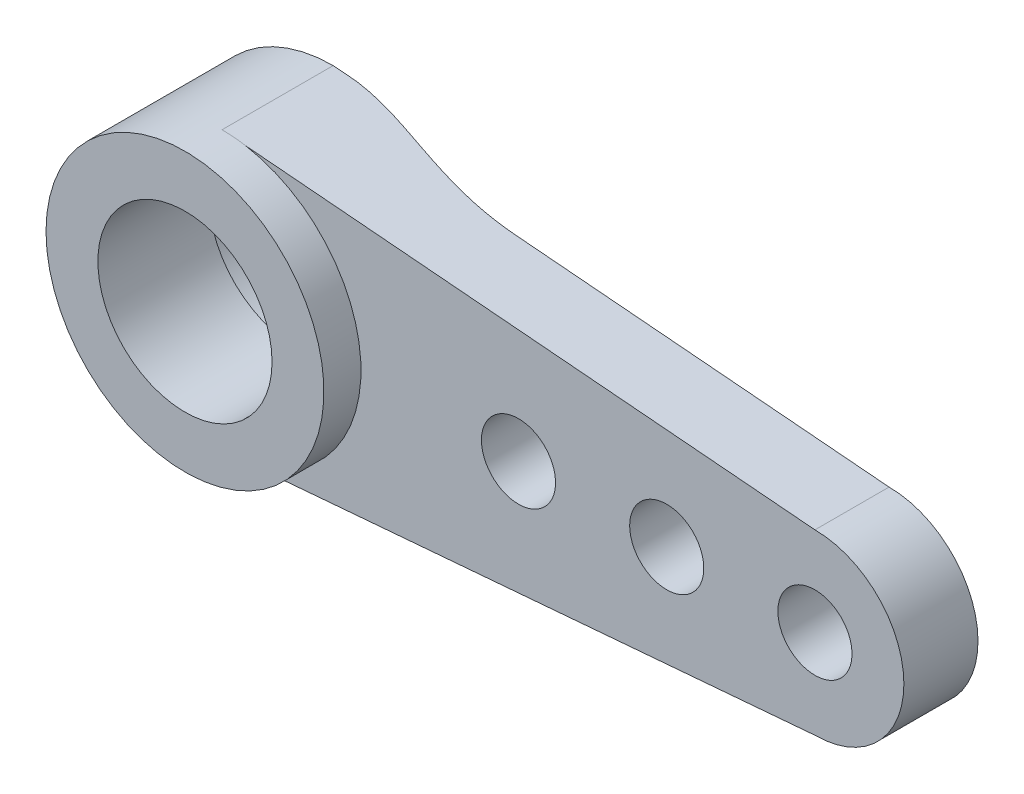
ISO-10303-21;
HEADER;
FILE_DESCRIPTION(('STEP AP214'),'2;1');
FILE_NAME('part.step','',(''),(''),'','','');
FILE_SCHEMA(('AUTOMOTIVE_DESIGN { 1 0 10303 214 1 1 1 1 }'));
ENDSEC;
DATA;
#1=APPLICATION_CONTEXT('core data for automotive mechanical design processes');
#2=APPLICATION_PROTOCOL_DEFINITION('international standard','automotive_design',2000,#1);
#3=PRODUCT_CONTEXT('',#1,'mechanical');
#4=PRODUCT('Part','Part','',(#3));
#5=PRODUCT_RELATED_PRODUCT_CATEGORY('part','',(#4));
#6=PRODUCT_DEFINITION_FORMATION('','',#4);
#7=PRODUCT_DEFINITION_CONTEXT('part definition',#1,'design');
#8=PRODUCT_DEFINITION('design','',#6,#7);
#9=PRODUCT_DEFINITION_SHAPE('','',#8);
#10=(LENGTH_UNIT() NAMED_UNIT(*) SI_UNIT(.MILLI.,.METRE.));
#11=(NAMED_UNIT(*) PLANE_ANGLE_UNIT() SI_UNIT($,.RADIAN.));
#12=(NAMED_UNIT(*) SI_UNIT($,.STERADIAN.) SOLID_ANGLE_UNIT());
#13=UNCERTAINTY_MEASURE_WITH_UNIT(LENGTH_MEASURE(1.E-05),#10,'distance_accuracy_value','');
#14=(GEOMETRIC_REPRESENTATION_CONTEXT(3) GLOBAL_UNCERTAINTY_ASSIGNED_CONTEXT((#13)) GLOBAL_UNIT_ASSIGNED_CONTEXT((#10,
#11,#12)) REPRESENTATION_CONTEXT('',''));
#15=CARTESIAN_POINT('',(0.,0.,0.));
#16=DIRECTION('',(0.,0.,1.));
#17=DIRECTION('',(1.,0.,0.));
#18=AXIS2_PLACEMENT_3D('',#15,#16,#17);
#19=CARTESIAN_POINT('',(0.,0.,0.));
#20=DIRECTION('',(0.,0.,1.));
#21=DIRECTION('',(1.,0.,0.));
#22=AXIS2_PLACEMENT_3D('',#19,#20,#21);
#23=PLANE('',#22);
#24=CARTESIAN_POINT('',(0.,0.,0.));
#25=DIRECTION('',(0.,0.,1.));
#26=DIRECTION('',(1.,0.,0.));
#27=AXIS2_PLACEMENT_3D('',#24,#25,#26);
#28=CIRCLE('',#27,2.35);
#29=CARTESIAN_POINT('',(2.35,0.,0.));
#30=VERTEX_POINT('',#29);
#31=EDGE_CURVE('E140',#30,#30,#28,.T.);
#32=ORIENTED_EDGE('',*,*,#31,.T.);
#33=EDGE_LOOP('',(#32));
#34=FACE_BOUND('',#33,.T.);
#35=CARTESIAN_POINT('',(0.,0.,0.));
#36=DIRECTION('',(0.,0.,-1.));
#37=DIRECTION('',(-1.,0.,0.));
#38=AXIS2_PLACEMENT_3D('',#35,#36,#37);
#39=CIRCLE('',#38,2.75);
#40=CARTESIAN_POINT('',(-2.75,0.,0.));
#41=VERTEX_POINT('',#40);
#42=EDGE_CURVE('E130',#41,#41,#39,.T.);
#43=ORIENTED_EDGE('',*,*,#42,.T.);
#44=EDGE_LOOP('',(#43));
#45=FACE_BOUND('',#44,.T.);
#46=ADVANCED_FACE('F43',(#34,#45),#23,.F.);
#47=CARTESIAN_POINT('',(0.314169632208205,-3.72349193728243,2.));
#48=DIRECTION('',(-0.0840762554154538,0.996459323442415,0.));
#49=DIRECTION('',(-0.996459323442415,-0.0840762554154538,0.));
#50=AXIS2_PLACEMENT_3D('',#47,#48,#49);
#51=PLANE('',#50);
#52=DIRECTION('',(0.,0.,-1.));
#53=VECTOR('',#52,1.);
#54=CARTESIAN_POINT('',(0.,-3.75,2.));
#55=LINE('',#54,#53);
#56=CARTESIAN_POINT('',(0.,-3.75,2.));
#57=VERTEX_POINT('',#56);
#58=CARTESIAN_POINT('',(0.,-3.75,-1.));
#59=VERTEX_POINT('',#58);
#60=EDGE_CURVE('E155',#57,#59,#55,.T.);
#61=ORIENTED_EDGE('',*,*,#60,.T.);
#62=DIRECTION('',(-0.996459323442415,-0.0840762554154538,0.));
#63=VECTOR('',#62,1.);
#64=CARTESIAN_POINT('',(0.314169632208205,-3.72349193728243,-1.));
#65=LINE('',#64,#63);
#66=CARTESIAN_POINT('',(0.628339264416419,-3.69698387456486,-1.));
#67=VERTEX_POINT('',#66);
#68=EDGE_CURVE('E123',#67,#59,#65,.T.);
#69=ORIENTED_EDGE('',*,*,#68,.F.);
#70=CARTESIAN_POINT('',(0.628339264416419,-3.69698387456486,-1.));
#71=CARTESIAN_POINT('',(0.697307809076873,-3.69116465360914,-0.995646343519187));
#72=CARTESIAN_POINT('',(0.766175130025618,-3.68535397340409,-0.989869657206065));
#73=CARTESIAN_POINT('',(0.903617625135459,-3.6737572628792,-0.975707941496995));
#74=CARTESIAN_POINT('',(0.97219290150449,-3.66797122393556,-0.967323916505959));
#75=CARTESIAN_POINT('',(1.17697233613225,-3.65069295913884,-0.938673764554081));
#76=CARTESIAN_POINT('',(1.31268782647033,-3.63924196464157,-0.914877548381426));
#77=CARTESIAN_POINT('',(1.58261540354773,-3.61646682532566,-0.860330672785768));
#78=CARTESIAN_POINT('',(1.71682799145541,-3.60514263822095,-0.829582408791605));
#79=CARTESIAN_POINT('',(1.98432680167271,-3.58257242610886,-0.76362642174831));
#80=CARTESIAN_POINT('',(2.11761154710652,-3.57132652571289,-0.728412796780356));
#81=CARTESIAN_POINT('',(2.40078592510154,-3.54743368756956,-0.651161822433077));
#82=CARTESIAN_POINT('',(2.55059419929654,-3.53479361443435,-0.608830890588668));
#83=CARTESIAN_POINT('',(2.85023264998082,-3.50951162015787,-0.524225869547491));
#84=CARTESIAN_POINT('',(3.00006282707764,-3.49686969896532,-0.481951782524331));
#85=CARTESIAN_POINT('',(3.30007241737523,-3.47155638978396,-0.399810269796279));
#86=CARTESIAN_POINT('',(3.45025056769592,-3.45888510835066,-0.359938282763937));
#87=CARTESIAN_POINT('',(3.75164512261767,-3.43345494277913,-0.284382062671771));
#88=CARTESIAN_POINT('',(3.90286139237834,-3.42069607001808,-0.248697296237507));
#89=CARTESIAN_POINT('',(4.20690839440776,-3.39504210422184,-0.183002412446932));
#90=CARTESIAN_POINT('',(4.35974211135114,-3.38214675935475,-0.153005995072535));
#91=CARTESIAN_POINT('',(4.66660902112056,-3.35625486384295,-0.100149696307815));
#92=CARTESIAN_POINT('',(4.82064191609038,-3.34325833832987,-0.0772880972815289));
#93=CARTESIAN_POINT('',(5.13110304168887,-3.3170631808575,-0.0396998057614398));
#94=CARTESIAN_POINT('',(5.2875403993614,-3.30386377880388,-0.0250470876141203));
#95=CARTESIAN_POINT('',(5.60116404300296,-3.27740178387162,-0.00517827823070864));
#96=CARTESIAN_POINT('',(5.75835094220332,-3.26413913925159,2.79034982661632E-05));
#97=CARTESIAN_POINT('',(5.91560113058202,-3.25087115460714,0.));
#98=B_SPLINE_CURVE_WITH_KNOTS('',3,(#70,#71,#72,#73,#74,#75,#76,#77,#78,#79,#80,#81,#82,#83,#84,
#85,#86,#87,#88,#89,#90,#91,#92,#93,#94,#95,#96,#97),.UNSPECIFIED.,.F.,.F.,(4,2,2,2,2,2,2,2,2,2,
2,2,2,4),(0.,0.208017689106241,0.41595534422088,0.830452596831007,1.24480724547458,
1.65971537385917,2.12827229827095,2.59684665676368,3.06450121446885,3.53209613681727,
4.00080330977544,4.46939755898619,4.94214928417651,5.41539664437466),.UNSPECIFIED.);
#99=CARTESIAN_POINT('',(5.91560113058202,-3.25087115460714,0.));
#100=VERTEX_POINT('',#99);
#101=EDGE_CURVE('E57',#67,#100,#98,.T.);
#102=ORIENTED_EDGE('',*,*,#101,.T.);
#103=DIRECTION('',(0.996459323442415,0.0840762554154538,0.));
#104=VECTOR('',#103,1.);
#105=CARTESIAN_POINT('',(0.314169632208205,-3.72349193728243,0.));
#106=LINE('',#105,#104);
#107=CARTESIAN_POINT('',(16.,-2.4,0.));
#108=VERTEX_POINT('',#107);
#109=EDGE_CURVE('E158',#100,#108,#106,.T.);
#110=ORIENTED_EDGE('',*,*,#109,.T.);
#111=DIRECTION('',(0.,0.,-1.));
#112=VECTOR('',#111,1.);
#113=CARTESIAN_POINT('',(16.,-2.4,2.));
#114=LINE('',#113,#112);
#115=CARTESIAN_POINT('',(16.,-2.4,2.));
#116=VERTEX_POINT('',#115);
#117=EDGE_CURVE('E169',#116,#108,#114,.T.);
#118=ORIENTED_EDGE('',*,*,#117,.F.);
#119=DIRECTION('',(0.996459323442415,0.0840762554154538,0.));
#120=VECTOR('',#119,1.);
#121=CARTESIAN_POINT('',(0.314169632208205,-3.72349193728243,2.));
#122=LINE('',#121,#120);
#123=CARTESIAN_POINT('',(0.628339264416414,-3.69698387456486,2.));
#124=VERTEX_POINT('',#123);
#125=EDGE_CURVE('E149',#124,#116,#122,.T.);
#126=ORIENTED_EDGE('',*,*,#125,.F.);
#127=EDGE_CURVE('E145',#57,#124,#122,.T.);
#128=ORIENTED_EDGE('',*,*,#127,.F.);
#129=EDGE_LOOP('',(#61,#69,#102,#110,#118,#126,#128));
#130=FACE_BOUND('',#129,.T.);
#131=ADVANCED_FACE('F177',(#130),#51,.F.);
#132=CARTESIAN_POINT('',(16.,0.,2.));
#133=DIRECTION('',(0.,0.,-1.));
#134=DIRECTION('',(-1.,0.,0.));
#135=AXIS2_PLACEMENT_3D('',#132,#133,#134);
#136=CYLINDRICAL_SURFACE('',#135,2.4);
#137=CARTESIAN_POINT('',(16.,0.,0.));
#138=DIRECTION('',(0.,0.,1.));
#139=DIRECTION('',(1.,0.,0.));
#140=AXIS2_PLACEMENT_3D('',#137,#138,#139);
#141=CIRCLE('',#140,2.4);
#142=CARTESIAN_POINT('',(16.,2.4,0.));
#143=VERTEX_POINT('',#142);
#144=EDGE_CURVE('E160',#108,#143,#141,.T.);
#145=ORIENTED_EDGE('',*,*,#144,.T.);
#146=DIRECTION('',(0.,0.,-1.));
#147=VECTOR('',#146,1.);
#148=CARTESIAN_POINT('',(16.,2.4,2.));
#149=LINE('',#148,#147);
#150=CARTESIAN_POINT('',(16.,2.4,2.));
#151=VERTEX_POINT('',#150);
#152=EDGE_CURVE('E167',#151,#143,#149,.T.);
#153=ORIENTED_EDGE('',*,*,#152,.F.);
#154=CARTESIAN_POINT('',(16.,0.,2.));
#155=DIRECTION('',(0.,0.,1.));
#156=DIRECTION('',(1.,0.,0.));
#157=AXIS2_PLACEMENT_3D('',#154,#155,#156);
#158=CIRCLE('',#157,2.4);
#159=EDGE_CURVE('E148',#116,#151,#158,.T.);
#160=ORIENTED_EDGE('',*,*,#159,.F.);
#161=ORIENTED_EDGE('',*,*,#117,.T.);
#162=EDGE_LOOP('',(#145,#153,#160,#161));
#163=FACE_BOUND('',#162,.T.);
#164=ADVANCED_FACE('F181',(#163),#136,.T.);
#165=CARTESIAN_POINT('',(0.314169632208205,3.72349193728243,2.));
#166=DIRECTION('',(0.0840762554154538,0.996459323442415,0.));
#167=DIRECTION('',(-0.996459323442415,0.0840762554154538,0.));
#168=AXIS2_PLACEMENT_3D('',#165,#166,#167);
#169=PLANE('',#168);
#170=DIRECTION('',(0.996459323442415,-0.0840762554154538,0.));
#171=VECTOR('',#170,1.);
#172=CARTESIAN_POINT('',(0.314169632208205,3.72349193728243,0.));
#173=LINE('',#172,#171);
#174=CARTESIAN_POINT('',(5.91560113058202,3.25087115460714,0.));
#175=VERTEX_POINT('',#174);
#176=EDGE_CURVE('E110',#175,#143,#173,.T.);
#177=ORIENTED_EDGE('',*,*,#176,.F.);
#178=CARTESIAN_POINT('',(5.91560113058202,3.25087115460714,0.));
#179=CARTESIAN_POINT('',(5.8223810347142,3.25873660019599,1.85233074722115E-06));
#180=CARTESIAN_POINT('',(5.72917408115278,3.26660093690273,-0.00182128048230477));
#181=CARTESIAN_POINT('',(5.54290973526612,3.28231699108692,-0.00892990292535579));
#182=CARTESIAN_POINT('',(5.44985231576945,3.29016871085695,-0.0142146693285458));
#183=CARTESIAN_POINT('',(5.17135717383487,3.31366673845768,-0.0349570064980779));
#184=CARTESIAN_POINT('',(4.98626852749528,3.32928359299259,-0.0553039433228232));
#185=CARTESIAN_POINT('',(4.61810269891063,3.36034758477942,-0.107209190519749));
#186=CARTESIAN_POINT('',(4.4350221748687,3.37579500399545,-0.138744466943538));
#187=CARTESIAN_POINT('',(4.07059315570442,3.40654370248744,-0.210936105991536));
#188=CARTESIAN_POINT('',(3.88924557068151,3.42184490497375,-0.251597013276189));
#189=CARTESIAN_POINT('',(3.58104291082371,3.44784950439925,-0.326603678525961));
#190=CARTESIAN_POINT('',(3.45378204869383,3.45858713964146,-0.359311780108495));
#191=CARTESIAN_POINT('',(3.19984629936514,3.48001296849107,-0.426930981262496));
#192=CARTESIAN_POINT('',(3.07317141442429,3.49070116190795,-0.461842089315281));
#193=CARTESIAN_POINT('',(2.82018869634357,3.51204657874601,-0.532595604277613));
#194=CARTESIAN_POINT('',(2.69388065728612,3.52270381954148,-0.568437282526414));
#195=CARTESIAN_POINT('',(2.44109547309834,3.54403256945733,-0.639615809919882));
#196=CARTESIAN_POINT('',(2.3146183012975,3.55470408082802,-0.674952565674266));
#197=CARTESIAN_POINT('',(2.06029112590282,3.57616293625195,-0.743583883172638));
#198=CARTESIAN_POINT('',(1.93243743923451,3.58695059106459,-0.776864907120628));
#199=CARTESIAN_POINT('',(1.67568028830843,3.60861447567398,-0.839090803045952));
#200=CARTESIAN_POINT('',(1.546777050505,3.61949068636364,-0.868036585568116));
#201=CARTESIAN_POINT('',(1.35217605089325,3.63591014570588,-0.906573550015068));
#202=CARTESIAN_POINT('',(1.28696339914608,3.64141246319705,-0.918625682489015));
#203=CARTESIAN_POINT('',(1.15621398974743,3.65244444461506,-0.940790837571174));
#204=CARTESIAN_POINT('',(1.09067725747785,3.65797410640031,-0.950904009646046));
#205=CARTESIAN_POINT('',(0.959155350104703,3.66907126733491,-0.968948471693051));
#206=CARTESIAN_POINT('',(0.893169504266445,3.67463882307752,-0.976874893619771));
#207=CARTESIAN_POINT('',(0.760932515856885,3.68579631897458,-0.990307351936384));
#208=CARTESIAN_POINT('',(0.694681291672577,3.69138626601513,-0.995812575028848));
#209=CARTESIAN_POINT('',(0.628339264416419,3.69698387456486,-0.999999999999999));
#210=B_SPLINE_CURVE_WITH_KNOTS('',3,(#178,#179,#180,#181,#182,#183,#184,#185,#186,#187,#188,
#189,#190,#191,#192,#193,#194,#195,#196,#197,#198,#199,#200,#201,#202,#203,#204,#205,#206,#207,
#208,#209),.UNSPECIFIED.,.F.,.F.,(4,2,2,2,2,2,2,2,2,2,2,2,2,2,2,4),(0.,0.280613830358858,
0.561169051758918,1.12129420707623,1.68027283535502,2.23953046104622,2.63501195788567,
3.03049497737555,3.4256771449433,3.8209314830202,4.21855935170722,4.61610358784941,
4.81571399344804,5.0153090056913,5.21534482639423,5.41544778928743),.UNSPECIFIED.);
#211=CARTESIAN_POINT('',(0.628339264416419,3.69698387456486,-1.));
#212=VERTEX_POINT('',#211);
#213=EDGE_CURVE('E11',#175,#212,#210,.T.);
#214=ORIENTED_EDGE('',*,*,#213,.T.);
#215=DIRECTION('',(0.996459323442415,-0.0840762554154538,0.));
#216=VECTOR('',#215,1.);
#217=CARTESIAN_POINT('',(0.314169632208205,3.72349193728243,-1.));
#218=LINE('',#217,#216);
#219=CARTESIAN_POINT('',(0.,3.75,-1.));
#220=VERTEX_POINT('',#219);
#221=EDGE_CURVE('E108',#220,#212,#218,.T.);
#222=ORIENTED_EDGE('',*,*,#221,.F.);
#223=DIRECTION('',(0.,0.,-1.));
#224=VECTOR('',#223,1.);
#225=CARTESIAN_POINT('',(0.,3.75,2.));
#226=LINE('',#225,#224);
#227=CARTESIAN_POINT('',(0.,3.75,2.));
#228=VERTEX_POINT('',#227);
#229=EDGE_CURVE('E165',#228,#220,#226,.T.);
#230=ORIENTED_EDGE('',*,*,#229,.F.);
#231=DIRECTION('',(0.996459323442415,-0.0840762554154538,0.));
#232=VECTOR('',#231,1.);
#233=CARTESIAN_POINT('',(0.314169632208205,3.72349193728243,2.));
#234=LINE('',#233,#232);
#235=CARTESIAN_POINT('',(0.628339264416414,3.69698387456486,2.));
#236=VERTEX_POINT('',#235);
#237=EDGE_CURVE('E153',#228,#236,#234,.T.);
#238=ORIENTED_EDGE('',*,*,#237,.T.);
#239=EDGE_CURVE('E152',#236,#151,#234,.T.);
#240=ORIENTED_EDGE('',*,*,#239,.T.);
#241=ORIENTED_EDGE('',*,*,#152,.T.);
#242=EDGE_LOOP('',(#177,#214,#222,#230,#238,#240,#241));
#243=FACE_BOUND('',#242,.T.);
#244=ADVANCED_FACE('F107',(#243),#169,.T.);
#245=CARTESIAN_POINT('',(0.,0.,2.));
#246=DIRECTION('',(0.,0.,-1.));
#247=DIRECTION('',(-1.,0.,0.));
#248=AXIS2_PLACEMENT_3D('',#245,#246,#247);
#249=CYLINDRICAL_SURFACE('',#248,2.35);
#250=ORIENTED_EDGE('',*,*,#31,.F.);
#251=EDGE_LOOP('',(#250));
#252=FACE_BOUND('',#251,.T.);
#253=CARTESIAN_POINT('',(0.,0.,3.));
#254=DIRECTION('',(0.,0.,1.));
#255=DIRECTION('',(1.,0.,0.));
#256=AXIS2_PLACEMENT_3D('',#253,#254,#255);
#257=CIRCLE('',#256,2.35);
#258=CARTESIAN_POINT('',(2.35,0.,3.));
#259=VERTEX_POINT('',#258);
#260=EDGE_CURVE('E129',#259,#259,#257,.T.);
#261=ORIENTED_EDGE('',*,*,#260,.T.);
#262=EDGE_LOOP('',(#261));
#263=FACE_BOUND('',#262,.T.);
#264=ADVANCED_FACE('F182',(#252,#263),#249,.F.);
#265=CARTESIAN_POINT('',(0.,0.,2.));
#266=DIRECTION('',(0.,0.,-1.));
#267=DIRECTION('',(-1.,0.,0.));
#268=AXIS2_PLACEMENT_3D('',#265,#266,#267);
#269=CYLINDRICAL_SURFACE('',#268,3.75);
#270=ORIENTED_EDGE('',*,*,#229,.T.);
#271=CARTESIAN_POINT('',(0.,0.,-1.));
#272=DIRECTION('',(0.,0.,-1.));
#273=DIRECTION('',(-1.,0.,0.));
#274=AXIS2_PLACEMENT_3D('',#271,#272,#273);
#275=CIRCLE('',#274,3.75);
#276=EDGE_CURVE('E120',#59,#220,#275,.T.);
#277=ORIENTED_EDGE('',*,*,#276,.F.);
#278=ORIENTED_EDGE('',*,*,#60,.F.);
#279=CARTESIAN_POINT('',(0.,0.,2.));
#280=DIRECTION('',(0.,0.,1.));
#281=DIRECTION('',(1.,0.,0.));
#282=AXIS2_PLACEMENT_3D('',#279,#280,#281);
#283=CIRCLE('',#282,3.75);
#284=EDGE_CURVE('E136',#57,#124,#283,.T.);
#285=ORIENTED_EDGE('',*,*,#284,.T.);
#286=EDGE_CURVE('E144',#124,#236,#283,.T.);
#287=ORIENTED_EDGE('',*,*,#286,.T.);
#288=EDGE_CURVE('E141',#236,#228,#283,.T.);
#289=ORIENTED_EDGE('',*,*,#288,.T.);
#290=EDGE_LOOP('',(#270,#277,#278,#285,#287,#289));
#291=FACE_BOUND('',#290,.T.);
#292=CARTESIAN_POINT('',(0.,0.,3.));
#293=DIRECTION('',(0.,0.,1.));
#294=DIRECTION('',(-1.,0.,0.));
#295=AXIS2_PLACEMENT_3D('',#292,#293,#294);
#296=CIRCLE('',#295,3.75);
#297=CARTESIAN_POINT('',(-3.75,0.,3.));
#298=VERTEX_POINT('',#297);
#299=EDGE_CURVE('E137',#298,#298,#296,.T.);
#300=ORIENTED_EDGE('',*,*,#299,.F.);
#301=EDGE_LOOP('',(#300));
#302=FACE_BOUND('',#301,.T.);
#303=ADVANCED_FACE('F184',(#291,#302),#269,.T.);
#304=CARTESIAN_POINT('',(0.,0.,2.));
#305=DIRECTION('',(0.,0.,1.));
#306=DIRECTION('',(1.,0.,0.));
#307=AXIS2_PLACEMENT_3D('',#304,#305,#306);
#308=PLANE('',#307);
#309=CARTESIAN_POINT('',(16.,0.,2.));
#310=DIRECTION('',(0.,0.,1.));
#311=DIRECTION('',(1.,0.,0.));
#312=AXIS2_PLACEMENT_3D('',#309,#310,#311);
#313=CIRCLE('',#312,1.);
#314=CARTESIAN_POINT('',(15.,0.,2.));
#315=VERTEX_POINT('',#314);
#316=EDGE_CURVE('E271',#315,#315,#313,.F.);
#317=ORIENTED_EDGE('',*,*,#316,.T.);
#318=EDGE_LOOP('',(#317));
#319=FACE_BOUND('',#318,.T.);
#320=CARTESIAN_POINT('',(12.,0.,2.));
#321=DIRECTION('',(0.,0.,1.));
#322=DIRECTION('',(1.,0.,0.));
#323=AXIS2_PLACEMENT_3D('',#320,#321,#322);
#324=CIRCLE('',#323,1.);
#325=CARTESIAN_POINT('',(11.,0.,2.));
#326=VERTEX_POINT('',#325);
#327=EDGE_CURVE('E276',#326,#326,#324,.F.);
#328=ORIENTED_EDGE('',*,*,#327,.T.);
#329=EDGE_LOOP('',(#328));
#330=FACE_BOUND('',#329,.T.);
#331=CARTESIAN_POINT('',(8.,0.,2.));
#332=DIRECTION('',(0.,0.,1.));
#333=DIRECTION('',(1.,0.,0.));
#334=AXIS2_PLACEMENT_3D('',#331,#332,#333);
#335=CIRCLE('',#334,1.);
#336=CARTESIAN_POINT('',(7.,0.,2.));
#337=VERTEX_POINT('',#336);
#338=EDGE_CURVE('E280',#337,#337,#335,.F.);
#339=ORIENTED_EDGE('',*,*,#338,.T.);
#340=EDGE_LOOP('',(#339));
#341=FACE_BOUND('',#340,.T.);
#342=ORIENTED_EDGE('',*,*,#286,.F.);
#343=ORIENTED_EDGE('',*,*,#125,.T.);
#344=ORIENTED_EDGE('',*,*,#159,.T.);
#345=ORIENTED_EDGE('',*,*,#239,.F.);
#346=EDGE_LOOP('',(#342,#343,#344,#345));
#347=FACE_BOUND('',#346,.T.);
#348=ADVANCED_FACE('F190',(#319,#330,#341,#347),#308,.T.);
#349=CARTESIAN_POINT('',(16.,0.,0.));
#350=DIRECTION('',(0.,0.,-1.));
#351=DIRECTION('',(-1.,0.,0.));
#352=AXIS2_PLACEMENT_3D('',#349,#350,#351);
#353=CIRCLE('',#352,1.);
#354=CARTESIAN_POINT('',(15.,0.,0.));
#355=VERTEX_POINT('',#354);
#356=EDGE_CURVE('E133',#355,#355,#353,.T.);
#357=ORIENTED_EDGE('',*,*,#356,.F.);
#358=EDGE_LOOP('',(#357));
#359=FACE_BOUND('',#358,.T.);
#360=CARTESIAN_POINT('',(12.,0.,0.));
#361=DIRECTION('',(0.,0.,-1.));
#362=DIRECTION('',(-1.,0.,0.));
#363=AXIS2_PLACEMENT_3D('',#360,#361,#362);
#364=CIRCLE('',#363,1.);
#365=CARTESIAN_POINT('',(11.,0.,0.));
#366=VERTEX_POINT('',#365);
#367=EDGE_CURVE('E221',#366,#366,#364,.T.);
#368=ORIENTED_EDGE('',*,*,#367,.F.);
#369=EDGE_LOOP('',(#368));
#370=FACE_BOUND('',#369,.T.);
#371=CARTESIAN_POINT('',(8.,0.,0.));
#372=DIRECTION('',(0.,0.,-1.));
#373=DIRECTION('',(-1.,0.,0.));
#374=AXIS2_PLACEMENT_3D('',#371,#372,#373);
#375=CIRCLE('',#374,1.);
#376=CARTESIAN_POINT('',(7.,0.,0.));
#377=VERTEX_POINT('',#376);
#378=EDGE_CURVE('E224',#377,#377,#375,.T.);
#379=ORIENTED_EDGE('',*,*,#378,.F.);
#380=EDGE_LOOP('',(#379));
#381=FACE_BOUND('',#380,.T.);
#382=ORIENTED_EDGE('',*,*,#109,.F.);
#383=CARTESIAN_POINT('',(0.,0.,0.));
#384=DIRECTION('',(0.,0.,1.));
#385=DIRECTION('',(1.,0.,0.));
#386=AXIS2_PLACEMENT_3D('',#383,#384,#385);
#387=CIRCLE('',#386,6.75);
#388=EDGE_CURVE('E70',#100,#175,#387,.T.);
#389=ORIENTED_EDGE('',*,*,#388,.T.);
#390=ORIENTED_EDGE('',*,*,#176,.T.);
#391=ORIENTED_EDGE('',*,*,#144,.F.);
#392=EDGE_LOOP('',(#382,#389,#390,#391));
#393=FACE_BOUND('',#392,.T.);
#394=ADVANCED_FACE('F198',(#359,#370,#381,#393),#23,.F.);
#395=CARTESIAN_POINT('',(0.,0.,2.));
#396=DIRECTION('',(0.,0.,-1.));
#397=DIRECTION('',(-1.,0.,0.));
#398=AXIS2_PLACEMENT_3D('',#395,#396,#397);
#399=PLANE('',#398);
#400=ORIENTED_EDGE('',*,*,#237,.F.);
#401=ORIENTED_EDGE('',*,*,#288,.F.);
#402=EDGE_LOOP('',(#400,#401));
#403=FACE_BOUND('',#402,.T.);
#404=ADVANCED_FACE('F204',(#403),#399,.T.);
#405=CARTESIAN_POINT('',(0.,0.,3.));
#406=DIRECTION('',(0.,0.,-1.));
#407=DIRECTION('',(-1.,0.,0.));
#408=AXIS2_PLACEMENT_3D('',#405,#406,#407);
#409=PLANE('',#408);
#410=ORIENTED_EDGE('',*,*,#299,.T.);
#411=EDGE_LOOP('',(#410));
#412=FACE_BOUND('',#411,.T.);
#413=ORIENTED_EDGE('',*,*,#260,.F.);
#414=EDGE_LOOP('',(#413));
#415=FACE_BOUND('',#414,.T.);
#416=ADVANCED_FACE('F210',(#412,#415),#409,.F.);
#417=ORIENTED_EDGE('',*,*,#284,.F.);
#418=ORIENTED_EDGE('',*,*,#127,.T.);
#419=EDGE_LOOP('',(#417,#418));
#420=FACE_BOUND('',#419,.T.);
#421=ADVANCED_FACE('F213',(#420),#399,.T.);
#422=CARTESIAN_POINT('',(0.,0.,-1.));
#423=DIRECTION('',(0.,0.,1.));
#424=DIRECTION('',(1.,0.,0.));
#425=AXIS2_PLACEMENT_3D('',#422,#423,#424);
#426=CYLINDRICAL_SURFACE('',#425,2.75);
#427=CARTESIAN_POINT('',(0.,0.,-1.));
#428=DIRECTION('',(0.,0.,-1.));
#429=DIRECTION('',(-1.,0.,0.));
#430=AXIS2_PLACEMENT_3D('',#427,#428,#429);
#431=CIRCLE('',#430,2.75);
#432=CARTESIAN_POINT('',(-2.75,0.,-1.));
#433=VERTEX_POINT('',#432);
#434=EDGE_CURVE('E121',#433,#433,#431,.T.);
#435=ORIENTED_EDGE('',*,*,#434,.T.);
#436=EDGE_LOOP('',(#435));
#437=FACE_BOUND('',#436,.T.);
#438=ORIENTED_EDGE('',*,*,#42,.F.);
#439=EDGE_LOOP('',(#438));
#440=FACE_BOUND('',#439,.T.);
#441=ADVANCED_FACE('F242',(#437,#440),#426,.F.);
#442=CARTESIAN_POINT('',(0.,0.,-1.));
#443=DIRECTION('',(0.,0.,-1.));
#444=DIRECTION('',(-1.,0.,0.));
#445=AXIS2_PLACEMENT_3D('',#442,#443,#444);
#446=PLANE('',#445);
#447=ORIENTED_EDGE('',*,*,#434,.F.);
#448=EDGE_LOOP('',(#447));
#449=FACE_BOUND('',#448,.T.);
#450=ORIENTED_EDGE('',*,*,#221,.T.);
#451=CARTESIAN_POINT('',(0.,0.,-1.));
#452=DIRECTION('',(0.,0.,-1.));
#453=DIRECTION('',(-1.,0.,0.));
#454=AXIS2_PLACEMENT_3D('',#451,#452,#453);
#455=CIRCLE('',#454,3.75);
#456=EDGE_CURVE('E118',#212,#67,#455,.T.);
#457=ORIENTED_EDGE('',*,*,#456,.T.);
#458=ORIENTED_EDGE('',*,*,#68,.T.);
#459=ORIENTED_EDGE('',*,*,#276,.T.);
#460=EDGE_LOOP('',(#450,#457,#458,#459));
#461=FACE_BOUND('',#460,.T.);
#462=ADVANCED_FACE('F116',(#449,#461),#446,.T.);
#463=CARTESIAN_POINT('',(0.,0.,-5.));
#464=DIRECTION('',(0.,0.,1.));
#465=DIRECTION('',(1.,0.,0.));
#466=AXIS2_PLACEMENT_3D('',#463,#464,#465);
#467=TOROIDAL_SURFACE('',#466,6.75,5.);
#468=ORIENTED_EDGE('',*,*,#213,.F.);
#469=ORIENTED_EDGE('',*,*,#388,.F.);
#470=ORIENTED_EDGE('',*,*,#101,.F.);
#471=ORIENTED_EDGE('',*,*,#456,.F.);
#472=EDGE_LOOP('',(#468,#469,#470,#471));
#473=FACE_BOUND('',#472,.T.);
#474=ADVANCED_FACE('F45',(#473),#467,.F.);
#475=CARTESIAN_POINT('',(8.,0.,3.001));
#476=DIRECTION('',(0.,0.,-1.));
#477=DIRECTION('',(-1.,0.,0.));
#478=AXIS2_PLACEMENT_3D('',#475,#476,#477);
#479=CYLINDRICAL_SURFACE('',#478,1.);
#480=CARTESIAN_POINT('',(7.,0.,2.));
#481=CARTESIAN_POINT('',(7.,0.,1.97916666666667));
#482=CARTESIAN_POINT('',(7.,0.,1.95833333333333));
#483=CARTESIAN_POINT('',(7.,0.,1.91666666666667));
#484=CARTESIAN_POINT('',(7.,0.,1.89583333333333));
#485=CARTESIAN_POINT('',(7.,0.,1.85416666666667));
#486=CARTESIAN_POINT('',(7.,0.,1.83333333333333));
#487=CARTESIAN_POINT('',(7.,0.,1.79166666666667));
#488=CARTESIAN_POINT('',(7.,0.,1.77083333333333));
#489=CARTESIAN_POINT('',(7.,0.,1.72916666666667));
#490=CARTESIAN_POINT('',(7.,0.,1.70833333333333));
#491=CARTESIAN_POINT('',(7.,0.,1.66666666666667));
#492=CARTESIAN_POINT('',(7.,0.,1.64583333333333));
#493=CARTESIAN_POINT('',(7.,0.,1.60416666666667));
#494=CARTESIAN_POINT('',(7.,0.,1.58333333333333));
#495=CARTESIAN_POINT('',(7.,0.,1.54166666666667));
#496=CARTESIAN_POINT('',(7.,0.,1.52083333333333));
#497=CARTESIAN_POINT('',(7.,0.,1.47916666666667));
#498=CARTESIAN_POINT('',(7.,0.,1.45833333333333));
#499=CARTESIAN_POINT('',(7.,0.,1.41666666666667));
#500=CARTESIAN_POINT('',(7.,0.,1.39583333333333));
#501=CARTESIAN_POINT('',(7.,0.,1.35416666666667));
#502=CARTESIAN_POINT('',(7.,0.,1.33333333333333));
#503=CARTESIAN_POINT('',(7.,0.,1.29166666666667));
#504=CARTESIAN_POINT('',(7.,0.,1.27083333333333));
#505=CARTESIAN_POINT('',(7.,0.,1.22916666666667));
#506=CARTESIAN_POINT('',(7.,0.,1.20833333333333));
#507=CARTESIAN_POINT('',(7.,0.,1.16666666666667));
#508=CARTESIAN_POINT('',(7.,0.,1.14583333333333));
#509=CARTESIAN_POINT('',(7.,0.,1.10416666666667));
#510=CARTESIAN_POINT('',(7.,0.,1.08333333333333));
#511=CARTESIAN_POINT('',(7.,0.,1.04166666666667));
#512=CARTESIAN_POINT('',(7.,0.,1.02083333333333));
#513=CARTESIAN_POINT('',(7.,0.,0.979166666666667));
#514=CARTESIAN_POINT('',(7.,0.,0.958333333333334));
#515=CARTESIAN_POINT('',(7.,0.,0.916666666666667));
#516=CARTESIAN_POINT('',(7.,0.,0.895833333333334));
#517=CARTESIAN_POINT('',(7.,0.,0.854166666666667));
#518=CARTESIAN_POINT('',(7.,0.,0.833333333333334));
#519=CARTESIAN_POINT('',(7.,0.,0.791666666666667));
#520=CARTESIAN_POINT('',(7.,0.,0.770833333333334));
#521=CARTESIAN_POINT('',(7.,0.,0.729166666666667));
#522=CARTESIAN_POINT('',(7.,0.,0.708333333333333));
#523=CARTESIAN_POINT('',(7.,0.,0.666666666666667));
#524=CARTESIAN_POINT('',(7.,0.,0.645833333333333));
#525=CARTESIAN_POINT('',(7.,0.,0.604166666666667));
#526=CARTESIAN_POINT('',(7.,0.,0.583333333333333));
#527=CARTESIAN_POINT('',(7.,0.,0.541666666666667));
#528=CARTESIAN_POINT('',(7.,0.,0.520833333333334));
#529=CARTESIAN_POINT('',(7.,0.,0.479166666666667));
#530=CARTESIAN_POINT('',(7.,0.,0.458333333333334));
#531=CARTESIAN_POINT('',(7.,0.,0.416666666666667));
#532=CARTESIAN_POINT('',(7.,0.,0.395833333333334));
#533=CARTESIAN_POINT('',(7.,0.,0.354166666666667));
#534=CARTESIAN_POINT('',(7.,0.,0.333333333333334));
#535=CARTESIAN_POINT('',(7.,0.,0.291666666666667));
#536=CARTESIAN_POINT('',(7.,0.,0.270833333333334));
#537=CARTESIAN_POINT('',(7.,0.,0.229166666666667));
#538=CARTESIAN_POINT('',(7.,0.,0.208333333333334));
#539=CARTESIAN_POINT('',(7.,0.,0.166666666666667));
#540=CARTESIAN_POINT('',(7.,0.,0.145833333333334));
#541=CARTESIAN_POINT('',(7.,0.,0.104166666666667));
#542=CARTESIAN_POINT('',(7.,0.,0.0833333333333338));
#543=CARTESIAN_POINT('',(7.,0.,0.0416666666666671));
#544=CARTESIAN_POINT('',(7.,0.,0.0208333333333338));
#545=CARTESIAN_POINT('',(7.,0.,0.));
#546=B_SPLINE_CURVE_WITH_KNOTS('',3,(#480,#481,#482,#483,#484,#485,#486,#487,#488,#489,#490,
#491,#492,#493,#494,#495,#496,#497,#498,#499,#500,#501,#502,#503,#504,#505,#506,#507,#508,#509,
#510,#511,#512,#513,#514,#515,#516,#517,#518,#519,#520,#521,#522,#523,#524,#525,#526,#527,#528,
#529,#530,#531,#532,#533,#534,#535,#536,#537,#538,#539,#540,#541,#542,#543,#544,#545),
.UNSPECIFIED.,.F.,.F.,(4,2,2,2,2,2,2,2,2,2,2,2,2,2,2,2,2,2,2,2,2,2,2,2,2,2,2,2,2,2,2,2,4),(0.,
0.0625000000000003,0.125,0.1875,0.25,0.3125,0.375,0.4375,0.5,0.5625,0.625,0.6875,0.75,0.8125,
0.875,0.9375,1.,1.0625,1.125,1.1875,1.25,1.3125,1.375,1.4375,1.5,1.5625,1.625,1.6875,1.75,
1.8125,1.875,1.9375,2.),.UNSPECIFIED.);
#547=EDGE_CURVE('BSEAM255',#337,#377,#546,.T.);
#548=ORIENTED_EDGE('',*,*,#338,.F.);
#549=ORIENTED_EDGE('',*,*,#378,.T.);
#550=ORIENTED_EDGE('',*,*,#547,.T.);
#551=ORIENTED_EDGE('',*,*,#547,.F.);
#552=EDGE_LOOP('',(#548,#550,#549,#551));
#553=FACE_BOUND('',#552,.T.);
#554=ADVANCED_FACE('F255',(#553),#479,.F.);
#555=CARTESIAN_POINT('',(12.,0.,3.001));
#556=DIRECTION('',(0.,0.,-1.));
#557=DIRECTION('',(-1.,0.,0.));
#558=AXIS2_PLACEMENT_3D('',#555,#556,#557);
#559=CYLINDRICAL_SURFACE('',#558,1.);
#560=CARTESIAN_POINT('',(11.,0.,2.));
#561=CARTESIAN_POINT('',(11.,0.,1.97916666666667));
#562=CARTESIAN_POINT('',(11.,0.,1.95833333333333));
#563=CARTESIAN_POINT('',(11.,0.,1.91666666666667));
#564=CARTESIAN_POINT('',(11.,0.,1.89583333333333));
#565=CARTESIAN_POINT('',(11.,0.,1.85416666666667));
#566=CARTESIAN_POINT('',(11.,0.,1.83333333333333));
#567=CARTESIAN_POINT('',(11.,0.,1.79166666666667));
#568=CARTESIAN_POINT('',(11.,0.,1.77083333333333));
#569=CARTESIAN_POINT('',(11.,0.,1.72916666666667));
#570=CARTESIAN_POINT('',(11.,0.,1.70833333333333));
#571=CARTESIAN_POINT('',(11.,0.,1.66666666666667));
#572=CARTESIAN_POINT('',(11.,0.,1.64583333333333));
#573=CARTESIAN_POINT('',(11.,0.,1.60416666666667));
#574=CARTESIAN_POINT('',(11.,0.,1.58333333333333));
#575=CARTESIAN_POINT('',(11.,0.,1.54166666666667));
#576=CARTESIAN_POINT('',(11.,0.,1.52083333333333));
#577=CARTESIAN_POINT('',(11.,0.,1.47916666666667));
#578=CARTESIAN_POINT('',(11.,0.,1.45833333333333));
#579=CARTESIAN_POINT('',(11.,0.,1.41666666666667));
#580=CARTESIAN_POINT('',(11.,0.,1.39583333333333));
#581=CARTESIAN_POINT('',(11.,0.,1.35416666666667));
#582=CARTESIAN_POINT('',(11.,0.,1.33333333333333));
#583=CARTESIAN_POINT('',(11.,0.,1.29166666666667));
#584=CARTESIAN_POINT('',(11.,0.,1.27083333333333));
#585=CARTESIAN_POINT('',(11.,0.,1.22916666666667));
#586=CARTESIAN_POINT('',(11.,0.,1.20833333333333));
#587=CARTESIAN_POINT('',(11.,0.,1.16666666666667));
#588=CARTESIAN_POINT('',(11.,0.,1.14583333333333));
#589=CARTESIAN_POINT('',(11.,0.,1.10416666666667));
#590=CARTESIAN_POINT('',(11.,0.,1.08333333333333));
#591=CARTESIAN_POINT('',(11.,0.,1.04166666666667));
#592=CARTESIAN_POINT('',(11.,0.,1.02083333333333));
#593=CARTESIAN_POINT('',(11.,0.,0.979166666666667));
#594=CARTESIAN_POINT('',(11.,0.,0.958333333333334));
#595=CARTESIAN_POINT('',(11.,0.,0.916666666666667));
#596=CARTESIAN_POINT('',(11.,0.,0.895833333333334));
#597=CARTESIAN_POINT('',(11.,0.,0.854166666666667));
#598=CARTESIAN_POINT('',(11.,0.,0.833333333333334));
#599=CARTESIAN_POINT('',(11.,0.,0.791666666666667));
#600=CARTESIAN_POINT('',(11.,0.,0.770833333333334));
#601=CARTESIAN_POINT('',(11.,0.,0.729166666666667));
#602=CARTESIAN_POINT('',(11.,0.,0.708333333333333));
#603=CARTESIAN_POINT('',(11.,0.,0.666666666666667));
#604=CARTESIAN_POINT('',(11.,0.,0.645833333333333));
#605=CARTESIAN_POINT('',(11.,0.,0.604166666666667));
#606=CARTESIAN_POINT('',(11.,0.,0.583333333333333));
#607=CARTESIAN_POINT('',(11.,0.,0.541666666666667));
#608=CARTESIAN_POINT('',(11.,0.,0.520833333333334));
#609=CARTESIAN_POINT('',(11.,0.,0.479166666666667));
#610=CARTESIAN_POINT('',(11.,0.,0.458333333333334));
#611=CARTESIAN_POINT('',(11.,0.,0.416666666666667));
#612=CARTESIAN_POINT('',(11.,0.,0.395833333333334));
#613=CARTESIAN_POINT('',(11.,0.,0.354166666666667));
#614=CARTESIAN_POINT('',(11.,0.,0.333333333333334));
#615=CARTESIAN_POINT('',(11.,0.,0.291666666666667));
#616=CARTESIAN_POINT('',(11.,0.,0.270833333333334));
#617=CARTESIAN_POINT('',(11.,0.,0.229166666666667));
#618=CARTESIAN_POINT('',(11.,0.,0.208333333333334));
#619=CARTESIAN_POINT('',(11.,0.,0.166666666666667));
#620=CARTESIAN_POINT('',(11.,0.,0.145833333333334));
#621=CARTESIAN_POINT('',(11.,0.,0.104166666666667));
#622=CARTESIAN_POINT('',(11.,0.,0.0833333333333338));
#623=CARTESIAN_POINT('',(11.,0.,0.0416666666666671));
#624=CARTESIAN_POINT('',(11.,0.,0.0208333333333338));
#625=CARTESIAN_POINT('',(11.,0.,0.));
#626=B_SPLINE_CURVE_WITH_KNOTS('',3,(#560,#561,#562,#563,#564,#565,#566,#567,#568,#569,#570,
#571,#572,#573,#574,#575,#576,#577,#578,#579,#580,#581,#582,#583,#584,#585,#586,#587,#588,#589,
#590,#591,#592,#593,#594,#595,#596,#597,#598,#599,#600,#601,#602,#603,#604,#605,#606,#607,#608,
#609,#610,#611,#612,#613,#614,#615,#616,#617,#618,#619,#620,#621,#622,#623,#624,#625),
.UNSPECIFIED.,.F.,.F.,(4,2,2,2,2,2,2,2,2,2,2,2,2,2,2,2,2,2,2,2,2,2,2,2,2,2,2,2,2,2,2,2,4),(0.,
0.0625000000000003,0.125,0.1875,0.25,0.3125,0.375,0.4375,0.5,0.5625,0.625,0.6875,0.75,0.8125,
0.875,0.9375,1.,1.0625,1.125,1.1875,1.25,1.3125,1.375,1.4375,1.5,1.5625,1.625,1.6875,1.75,
1.8125,1.875,1.9375,2.),.UNSPECIFIED.);
#627=EDGE_CURVE('BSEAM258',#326,#366,#626,.T.);
#628=ORIENTED_EDGE('',*,*,#327,.F.);
#629=ORIENTED_EDGE('',*,*,#367,.T.);
#630=ORIENTED_EDGE('',*,*,#627,.T.);
#631=ORIENTED_EDGE('',*,*,#627,.F.);
#632=EDGE_LOOP('',(#628,#630,#629,#631));
#633=FACE_BOUND('',#632,.T.);
#634=ADVANCED_FACE('F258',(#633),#559,.F.);
#635=CARTESIAN_POINT('',(16.,0.,3.001));
#636=DIRECTION('',(0.,0.,-1.));
#637=DIRECTION('',(-1.,0.,0.));
#638=AXIS2_PLACEMENT_3D('',#635,#636,#637);
#639=CYLINDRICAL_SURFACE('',#638,1.);
#640=CARTESIAN_POINT('',(15.,0.,2.));
#641=CARTESIAN_POINT('',(15.,0.,1.97916666666667));
#642=CARTESIAN_POINT('',(15.,0.,1.95833333333333));
#643=CARTESIAN_POINT('',(15.,0.,1.91666666666667));
#644=CARTESIAN_POINT('',(15.,0.,1.89583333333333));
#645=CARTESIAN_POINT('',(15.,0.,1.85416666666667));
#646=CARTESIAN_POINT('',(15.,0.,1.83333333333333));
#647=CARTESIAN_POINT('',(15.,0.,1.79166666666667));
#648=CARTESIAN_POINT('',(15.,0.,1.77083333333333));
#649=CARTESIAN_POINT('',(15.,0.,1.72916666666667));
#650=CARTESIAN_POINT('',(15.,0.,1.70833333333333));
#651=CARTESIAN_POINT('',(15.,0.,1.66666666666667));
#652=CARTESIAN_POINT('',(15.,0.,1.64583333333333));
#653=CARTESIAN_POINT('',(15.,0.,1.60416666666667));
#654=CARTESIAN_POINT('',(15.,0.,1.58333333333333));
#655=CARTESIAN_POINT('',(15.,0.,1.54166666666667));
#656=CARTESIAN_POINT('',(15.,0.,1.52083333333333));
#657=CARTESIAN_POINT('',(15.,0.,1.47916666666667));
#658=CARTESIAN_POINT('',(15.,0.,1.45833333333333));
#659=CARTESIAN_POINT('',(15.,0.,1.41666666666667));
#660=CARTESIAN_POINT('',(15.,0.,1.39583333333333));
#661=CARTESIAN_POINT('',(15.,0.,1.35416666666667));
#662=CARTESIAN_POINT('',(15.,0.,1.33333333333333));
#663=CARTESIAN_POINT('',(15.,0.,1.29166666666667));
#664=CARTESIAN_POINT('',(15.,0.,1.27083333333333));
#665=CARTESIAN_POINT('',(15.,0.,1.22916666666667));
#666=CARTESIAN_POINT('',(15.,0.,1.20833333333333));
#667=CARTESIAN_POINT('',(15.,0.,1.16666666666667));
#668=CARTESIAN_POINT('',(15.,0.,1.14583333333333));
#669=CARTESIAN_POINT('',(15.,0.,1.10416666666667));
#670=CARTESIAN_POINT('',(15.,0.,1.08333333333333));
#671=CARTESIAN_POINT('',(15.,0.,1.04166666666667));
#672=CARTESIAN_POINT('',(15.,0.,1.02083333333333));
#673=CARTESIAN_POINT('',(15.,0.,0.979166666666667));
#674=CARTESIAN_POINT('',(15.,0.,0.958333333333334));
#675=CARTESIAN_POINT('',(15.,0.,0.916666666666667));
#676=CARTESIAN_POINT('',(15.,0.,0.895833333333334));
#677=CARTESIAN_POINT('',(15.,0.,0.854166666666667));
#678=CARTESIAN_POINT('',(15.,0.,0.833333333333334));
#679=CARTESIAN_POINT('',(15.,0.,0.791666666666667));
#680=CARTESIAN_POINT('',(15.,0.,0.770833333333334));
#681=CARTESIAN_POINT('',(15.,0.,0.729166666666667));
#682=CARTESIAN_POINT('',(15.,0.,0.708333333333333));
#683=CARTESIAN_POINT('',(15.,0.,0.666666666666667));
#684=CARTESIAN_POINT('',(15.,0.,0.645833333333333));
#685=CARTESIAN_POINT('',(15.,0.,0.604166666666667));
#686=CARTESIAN_POINT('',(15.,0.,0.583333333333333));
#687=CARTESIAN_POINT('',(15.,0.,0.541666666666667));
#688=CARTESIAN_POINT('',(15.,0.,0.520833333333334));
#689=CARTESIAN_POINT('',(15.,0.,0.479166666666667));
#690=CARTESIAN_POINT('',(15.,0.,0.458333333333334));
#691=CARTESIAN_POINT('',(15.,0.,0.416666666666667));
#692=CARTESIAN_POINT('',(15.,0.,0.395833333333334));
#693=CARTESIAN_POINT('',(15.,0.,0.354166666666667));
#694=CARTESIAN_POINT('',(15.,0.,0.333333333333334));
#695=CARTESIAN_POINT('',(15.,0.,0.291666666666667));
#696=CARTESIAN_POINT('',(15.,0.,0.270833333333334));
#697=CARTESIAN_POINT('',(15.,0.,0.229166666666667));
#698=CARTESIAN_POINT('',(15.,0.,0.208333333333334));
#699=CARTESIAN_POINT('',(15.,0.,0.166666666666667));
#700=CARTESIAN_POINT('',(15.,0.,0.145833333333334));
#701=CARTESIAN_POINT('',(15.,0.,0.104166666666667));
#702=CARTESIAN_POINT('',(15.,0.,0.0833333333333338));
#703=CARTESIAN_POINT('',(15.,0.,0.0416666666666671));
#704=CARTESIAN_POINT('',(15.,0.,0.0208333333333338));
#705=CARTESIAN_POINT('',(15.,0.,0.));
#706=B_SPLINE_CURVE_WITH_KNOTS('',3,(#640,#641,#642,#643,#644,#645,#646,#647,#648,#649,#650,
#651,#652,#653,#654,#655,#656,#657,#658,#659,#660,#661,#662,#663,#664,#665,#666,#667,#668,#669,
#670,#671,#672,#673,#674,#675,#676,#677,#678,#679,#680,#681,#682,#683,#684,#685,#686,#687,#688,
#689,#690,#691,#692,#693,#694,#695,#696,#697,#698,#699,#700,#701,#702,#703,#704,#705),
.UNSPECIFIED.,.F.,.F.,(4,2,2,2,2,2,2,2,2,2,2,2,2,2,2,2,2,2,2,2,2,2,2,2,2,2,2,2,2,2,2,2,4),(0.,
0.0625000000000003,0.125,0.1875,0.25,0.3125,0.375,0.4375,0.5,0.5625,0.625,0.6875,0.75,0.8125,
0.875,0.9375,1.,1.0625,1.125,1.1875,1.25,1.3125,1.375,1.4375,1.5,1.5625,1.625,1.6875,1.75,
1.8125,1.875,1.9375,2.),.UNSPECIFIED.);
#707=EDGE_CURVE('BSEAM262',#315,#355,#706,.T.);
#708=ORIENTED_EDGE('',*,*,#316,.F.);
#709=ORIENTED_EDGE('',*,*,#356,.T.);
#710=ORIENTED_EDGE('',*,*,#707,.T.);
#711=ORIENTED_EDGE('',*,*,#707,.F.);
#712=EDGE_LOOP('',(#708,#710,#709,#711));
#713=FACE_BOUND('',#712,.T.);
#714=ADVANCED_FACE('F262',(#713),#639,.F.);
#715=CLOSED_SHELL('',(#46,#131,#164,#244,#264,#303,#348,#394,#404,#416,#421,#441,#462,#474,#554,
#634,#714));
#716=MANIFOLD_SOLID_BREP('B2',#715);
#717=ADVANCED_BREP_SHAPE_REPRESENTATION('',(#18,#716),#14);
#718=SHAPE_DEFINITION_REPRESENTATION(#9,#717);
ENDSEC;
END-ISO-10303-21;
